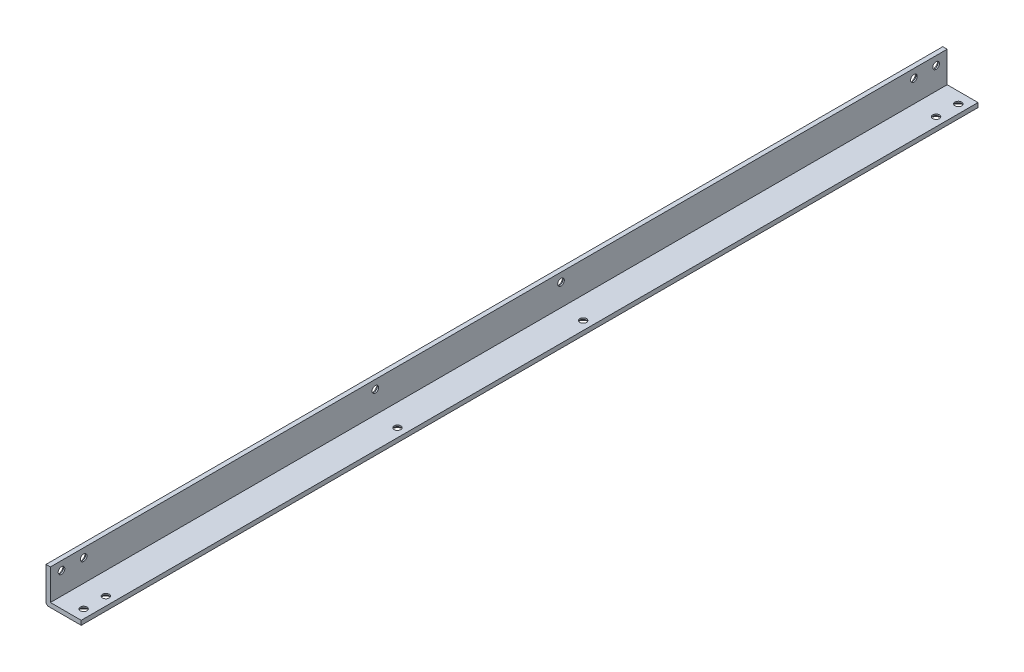
ISO-10303-21;
HEADER;
FILE_DESCRIPTION(('STEP AP214'),'2;1');
FILE_NAME('part.step','',(''),(''),'','','');
FILE_SCHEMA(('AUTOMOTIVE_DESIGN { 1 0 10303 214 1 1 1 1 }'));
ENDSEC;
DATA;
#1=APPLICATION_CONTEXT('core data for automotive mechanical design processes');
#2=APPLICATION_PROTOCOL_DEFINITION('international standard','automotive_design',2000,#1);
#3=PRODUCT_CONTEXT('',#1,'mechanical');
#4=PRODUCT('Part','Part','',(#3));
#5=PRODUCT_RELATED_PRODUCT_CATEGORY('part','',(#4));
#6=PRODUCT_DEFINITION_FORMATION('','',#4);
#7=PRODUCT_DEFINITION_CONTEXT('part definition',#1,'design');
#8=PRODUCT_DEFINITION('design','',#6,#7);
#9=PRODUCT_DEFINITION_SHAPE('','',#8);
#10=(LENGTH_UNIT() NAMED_UNIT(*) SI_UNIT(.MILLI.,.METRE.));
#11=(NAMED_UNIT(*) PLANE_ANGLE_UNIT() SI_UNIT($,.RADIAN.));
#12=(NAMED_UNIT(*) SI_UNIT($,.STERADIAN.) SOLID_ANGLE_UNIT());
#13=UNCERTAINTY_MEASURE_WITH_UNIT(LENGTH_MEASURE(1.E-05),#10,'distance_accuracy_value','');
#14=(GEOMETRIC_REPRESENTATION_CONTEXT(3) GLOBAL_UNCERTAINTY_ASSIGNED_CONTEXT((#13)) GLOBAL_UNIT_ASSIGNED_CONTEXT((#10,
#11,#12)) REPRESENTATION_CONTEXT('',''));
#15=CARTESIAN_POINT('',(0.,0.,0.));
#16=DIRECTION('',(0.,0.,1.));
#17=DIRECTION('',(1.,0.,0.));
#18=AXIS2_PLACEMENT_3D('',#15,#16,#17);
#19=CARTESIAN_POINT('',(0.,1.5875,0.));
#20=DIRECTION('',(1.,0.,0.));
#21=DIRECTION('',(0.,0.,-1.));
#22=AXIS2_PLACEMENT_3D('',#19,#20,#21);
#23=PLANE('',#22);
#24=CARTESIAN_POINT('',(0.,9.5875,4.));
#25=DIRECTION('',(-1.,0.,0.));
#26=DIRECTION('',(0.,0.,1.));
#27=AXIS2_PLACEMENT_3D('',#24,#25,#26);
#28=CIRCLE('',#27,2.3);
#29=CARTESIAN_POINT('',(0.,9.5875,6.3));
#30=VERTEX_POINT('',#29);
#31=EDGE_CURVE('E183',#30,#30,#28,.T.);
#32=ORIENTED_EDGE('',*,*,#31,.F.);
#33=EDGE_LOOP('',(#32));
#34=FACE_BOUND('',#33,.T.);
#35=CARTESIAN_POINT('',(0.,9.5875,12.));
#36=DIRECTION('',(-1.,0.,0.));
#37=DIRECTION('',(0.,0.,1.));
#38=AXIS2_PLACEMENT_3D('',#35,#36,#37);
#39=CIRCLE('',#38,2.3);
#40=CARTESIAN_POINT('',(0.,9.5875,14.3));
#41=VERTEX_POINT('',#40);
#42=EDGE_CURVE('E178',#41,#41,#39,.T.);
#43=ORIENTED_EDGE('',*,*,#42,.F.);
#44=EDGE_LOOP('',(#43));
#45=FACE_BOUND('',#44,.T.);
#46=CARTESIAN_POINT('',(0.,9.5875,139.3));
#47=DIRECTION('',(-1.,0.,0.));
#48=DIRECTION('',(0.,0.,1.));
#49=AXIS2_PLACEMENT_3D('',#46,#47,#48);
#50=CIRCLE('',#49,2.3);
#51=CARTESIAN_POINT('',(0.,9.5875,141.6));
#52=VERTEX_POINT('',#51);
#53=EDGE_CURVE('E173',#52,#52,#50,.T.);
#54=ORIENTED_EDGE('',*,*,#53,.F.);
#55=EDGE_LOOP('',(#54));
#56=FACE_BOUND('',#55,.T.);
#57=CARTESIAN_POINT('',(0.,9.5875,206.3));
#58=DIRECTION('',(-1.,0.,0.));
#59=DIRECTION('',(0.,0.,1.));
#60=AXIS2_PLACEMENT_3D('',#57,#58,#59);
#61=CIRCLE('',#60,2.3);
#62=CARTESIAN_POINT('',(0.,9.5875,208.6));
#63=VERTEX_POINT('',#62);
#64=EDGE_CURVE('E168',#63,#63,#61,.T.);
#65=ORIENTED_EDGE('',*,*,#64,.F.);
#66=EDGE_LOOP('',(#65));
#67=FACE_BOUND('',#66,.T.);
#68=CARTESIAN_POINT('',(0.,9.5875,311.5));
#69=DIRECTION('',(-1.,0.,0.));
#70=DIRECTION('',(0.,0.,1.));
#71=AXIS2_PLACEMENT_3D('',#68,#69,#70);
#72=CIRCLE('',#71,2.3);
#73=CARTESIAN_POINT('',(0.,9.5875,313.8));
#74=VERTEX_POINT('',#73);
#75=EDGE_CURVE('E158',#74,#74,#72,.T.);
#76=ORIENTED_EDGE('',*,*,#75,.F.);
#77=EDGE_LOOP('',(#76));
#78=FACE_BOUND('',#77,.T.);
#79=DIRECTION('',(0.,-1.,0.));
#80=VECTOR('',#79,1.);
#81=CARTESIAN_POINT('',(0.,1.5875,0.));
#82=LINE('',#81,#80);
#83=CARTESIAN_POINT('',(0.,12.7,0.));
#84=VERTEX_POINT('',#83);
#85=CARTESIAN_POINT('',(0.,1.,0.));
#86=VERTEX_POINT('',#85);
#87=EDGE_CURVE('E139',#84,#86,#82,.T.);
#88=ORIENTED_EDGE('',*,*,#87,.T.);
#89=DIRECTION('',(0.,0.,1.));
#90=VECTOR('',#89,1.);
#91=CARTESIAN_POINT('',(0.,1.,0.));
#92=LINE('',#91,#90);
#93=CARTESIAN_POINT('',(0.,1.,323.5));
#94=VERTEX_POINT('',#93);
#95=EDGE_CURVE('E99',#86,#94,#92,.T.);
#96=ORIENTED_EDGE('',*,*,#95,.T.);
#97=DIRECTION('',(0.,-1.,0.));
#98=VECTOR('',#97,1.);
#99=CARTESIAN_POINT('',(0.,1.5875,323.5));
#100=LINE('',#99,#98);
#101=CARTESIAN_POINT('',(0.,12.7,323.5));
#102=VERTEX_POINT('',#101);
#103=EDGE_CURVE('E92',#102,#94,#100,.T.);
#104=ORIENTED_EDGE('',*,*,#103,.F.);
#105=DIRECTION('',(0.,0.,1.));
#106=VECTOR('',#105,1.);
#107=CARTESIAN_POINT('',(0.,12.7,0.));
#108=LINE('',#107,#106);
#109=EDGE_CURVE('E97',#84,#102,#108,.T.);
#110=ORIENTED_EDGE('',*,*,#109,.F.);
#111=EDGE_LOOP('',(#88,#96,#104,#110));
#112=FACE_BOUND('',#111,.T.);
#113=CARTESIAN_POINT('',(0.,9.5875,319.5));
#114=DIRECTION('',(-1.,0.,0.));
#115=DIRECTION('',(0.,0.,1.));
#116=AXIS2_PLACEMENT_3D('',#113,#114,#115);
#117=CIRCLE('',#116,2.3);
#118=CARTESIAN_POINT('',(0.,9.5875,321.8));
#119=VERTEX_POINT('',#118);
#120=EDGE_CURVE('E163',#119,#119,#117,.T.);
#121=ORIENTED_EDGE('',*,*,#120,.F.);
#122=EDGE_LOOP('',(#121));
#123=FACE_BOUND('',#122,.T.);
#124=ADVANCED_FACE('F32',(#34,#45,#56,#67,#78,#112,#123),#23,.F.);
#125=CARTESIAN_POINT('',(0.,1.5875,323.5));
#126=DIRECTION('',(0.,0.,-1.));
#127=DIRECTION('',(-1.,0.,0.));
#128=AXIS2_PLACEMENT_3D('',#125,#126,#127);
#129=PLANE('',#128);
#130=ORIENTED_EDGE('',*,*,#103,.T.);
#131=CARTESIAN_POINT('',(1.,1.,323.5));
#132=DIRECTION('',(0.,0.,-1.));
#133=DIRECTION('',(-1.,0.,0.));
#134=AXIS2_PLACEMENT_3D('',#131,#132,#133);
#135=CIRCLE('',#134,1.);
#136=CARTESIAN_POINT('',(1.,0.,323.5));
#137=VERTEX_POINT('',#136);
#138=EDGE_CURVE('E56',#94,#137,#135,.F.);
#139=ORIENTED_EDGE('',*,*,#138,.T.);
#140=DIRECTION('',(1.,0.,0.));
#141=VECTOR('',#140,1.);
#142=CARTESIAN_POINT('',(0.,0.,323.5));
#143=LINE('',#142,#141);
#144=CARTESIAN_POINT('',(12.7,0.,323.5));
#145=VERTEX_POINT('',#144);
#146=EDGE_CURVE('E131',#137,#145,#143,.T.);
#147=ORIENTED_EDGE('',*,*,#146,.T.);
#148=DIRECTION('',(0.,-1.,0.));
#149=VECTOR('',#148,1.);
#150=CARTESIAN_POINT('',(12.7,1.5875,323.5));
#151=LINE('',#150,#149);
#152=CARTESIAN_POINT('',(12.7,1.5875,323.5));
#153=VERTEX_POINT('',#152);
#154=EDGE_CURVE('E100',#153,#145,#151,.T.);
#155=ORIENTED_EDGE('',*,*,#154,.F.);
#156=DIRECTION('',(1.,0.,0.));
#157=VECTOR('',#156,1.);
#158=CARTESIAN_POINT('',(0.,1.5875,323.5));
#159=LINE('',#158,#157);
#160=CARTESIAN_POINT('',(1.58750000000002,1.5875,323.5));
#161=VERTEX_POINT('',#160);
#162=EDGE_CURVE('E132',#161,#153,#159,.T.);
#163=ORIENTED_EDGE('',*,*,#162,.F.);
#164=DIRECTION('',(0.,-1.,0.));
#165=VECTOR('',#164,1.);
#166=CARTESIAN_POINT('',(1.58750000000004,12.7,323.5));
#167=LINE('',#166,#165);
#168=CARTESIAN_POINT('',(1.58750000000004,12.7,323.5));
#169=VERTEX_POINT('',#168);
#170=EDGE_CURVE('E107',#169,#161,#167,.T.);
#171=ORIENTED_EDGE('',*,*,#170,.F.);
#172=DIRECTION('',(1.,0.,0.));
#173=VECTOR('',#172,1.);
#174=CARTESIAN_POINT('',(0.,12.7,323.5));
#175=LINE('',#174,#173);
#176=EDGE_CURVE('E103',#102,#169,#175,.T.);
#177=ORIENTED_EDGE('',*,*,#176,.F.);
#178=EDGE_LOOP('',(#130,#139,#147,#155,#163,#171,#177));
#179=FACE_BOUND('',#178,.T.);
#180=ADVANCED_FACE('F104',(#179),#129,.F.);
#181=CARTESIAN_POINT('',(12.7,1.5875,0.));
#182=DIRECTION('',(-1.,0.,0.));
#183=DIRECTION('',(0.,0.,1.));
#184=AXIS2_PLACEMENT_3D('',#181,#182,#183);
#185=PLANE('',#184);
#186=DIRECTION('',(0.,0.,-1.));
#187=VECTOR('',#186,1.);
#188=CARTESIAN_POINT('',(12.7,0.,0.));
#189=LINE('',#188,#187);
#190=CARTESIAN_POINT('',(12.7,0.,0.));
#191=VERTEX_POINT('',#190);
#192=EDGE_CURVE('E141',#145,#191,#189,.T.);
#193=ORIENTED_EDGE('',*,*,#192,.T.);
#194=DIRECTION('',(0.,-1.,0.));
#195=VECTOR('',#194,1.);
#196=CARTESIAN_POINT('',(12.7,1.5875,0.));
#197=LINE('',#196,#195);
#198=CARTESIAN_POINT('',(12.7,1.5875,0.));
#199=VERTEX_POINT('',#198);
#200=EDGE_CURVE('E145',#199,#191,#197,.T.);
#201=ORIENTED_EDGE('',*,*,#200,.F.);
#202=DIRECTION('',(0.,0.,-1.));
#203=VECTOR('',#202,1.);
#204=CARTESIAN_POINT('',(12.7,1.5875,0.));
#205=LINE('',#204,#203);
#206=EDGE_CURVE('E134',#153,#199,#205,.T.);
#207=ORIENTED_EDGE('',*,*,#206,.F.);
#208=ORIENTED_EDGE('',*,*,#154,.T.);
#209=EDGE_LOOP('',(#193,#201,#207,#208));
#210=FACE_BOUND('',#209,.T.);
#211=ADVANCED_FACE('F277',(#210),#185,.F.);
#212=CARTESIAN_POINT('',(0.,1.5875,0.));
#213=DIRECTION('',(0.,0.,1.));
#214=DIRECTION('',(1.,0.,0.));
#215=AXIS2_PLACEMENT_3D('',#212,#213,#214);
#216=PLANE('',#215);
#217=DIRECTION('',(-1.,0.,0.));
#218=VECTOR('',#217,1.);
#219=CARTESIAN_POINT('',(0.,0.,0.));
#220=LINE('',#219,#218);
#221=CARTESIAN_POINT('',(1.,0.,0.));
#222=VERTEX_POINT('',#221);
#223=EDGE_CURVE('E135',#191,#222,#220,.T.);
#224=ORIENTED_EDGE('',*,*,#223,.T.);
#225=CARTESIAN_POINT('',(1.,1.,0.));
#226=DIRECTION('',(0.,0.,1.));
#227=DIRECTION('',(1.,0.,0.));
#228=AXIS2_PLACEMENT_3D('',#225,#226,#227);
#229=CIRCLE('',#228,1.);
#230=EDGE_CURVE('E11',#222,#86,#229,.F.);
#231=ORIENTED_EDGE('',*,*,#230,.T.);
#232=ORIENTED_EDGE('',*,*,#87,.F.);
#233=DIRECTION('',(-1.,0.,0.));
#234=VECTOR('',#233,1.);
#235=CARTESIAN_POINT('',(0.,12.7,0.));
#236=LINE('',#235,#234);
#237=CARTESIAN_POINT('',(1.5875,12.7,0.));
#238=VERTEX_POINT('',#237);
#239=EDGE_CURVE('E115',#238,#84,#236,.T.);
#240=ORIENTED_EDGE('',*,*,#239,.F.);
#241=DIRECTION('',(0.,-1.,0.));
#242=VECTOR('',#241,1.);
#243=CARTESIAN_POINT('',(1.5875,12.7,0.));
#244=LINE('',#243,#242);
#245=CARTESIAN_POINT('',(1.5875,1.5875,0.));
#246=VERTEX_POINT('',#245);
#247=EDGE_CURVE('E126',#238,#246,#244,.T.);
#248=ORIENTED_EDGE('',*,*,#247,.T.);
#249=DIRECTION('',(-1.,0.,0.));
#250=VECTOR('',#249,1.);
#251=CARTESIAN_POINT('',(0.,1.5875,0.));
#252=LINE('',#251,#250);
#253=EDGE_CURVE('E137',#199,#246,#252,.T.);
#254=ORIENTED_EDGE('',*,*,#253,.F.);
#255=ORIENTED_EDGE('',*,*,#200,.T.);
#256=EDGE_LOOP('',(#224,#231,#232,#240,#248,#254,#255));
#257=FACE_BOUND('',#256,.T.);
#258=ADVANCED_FACE('F284',(#257),#216,.F.);
#259=CARTESIAN_POINT('',(0.,1.5875,0.));
#260=DIRECTION('',(0.,1.,0.));
#261=DIRECTION('',(0.,0.,1.));
#262=AXIS2_PLACEMENT_3D('',#259,#260,#261);
#263=PLANE('',#262);
#264=CARTESIAN_POINT('',(9.58750000000004,1.5875,4.));
#265=DIRECTION('',(0.,1.,0.));
#266=DIRECTION('',(0.,0.,1.));
#267=AXIS2_PLACEMENT_3D('',#264,#265,#266);
#268=CIRCLE('',#267,1.19999999999999);
#269=CARTESIAN_POINT('',(9.58750000000004,1.5875,5.19999999999999));
#270=VERTEX_POINT('',#269);
#271=EDGE_CURVE('E36',#270,#270,#268,.T.);
#272=ORIENTED_EDGE('',*,*,#271,.F.);
#273=EDGE_LOOP('',(#272));
#274=FACE_BOUND('',#273,.T.);
#275=CARTESIAN_POINT('',(9.58750000000004,1.5875,12.));
#276=DIRECTION('',(0.,1.,0.));
#277=DIRECTION('',(0.,0.,1.));
#278=AXIS2_PLACEMENT_3D('',#275,#276,#277);
#279=CIRCLE('',#278,1.19999999999999);
#280=CARTESIAN_POINT('',(9.58750000000004,1.5875,13.2));
#281=VERTEX_POINT('',#280);
#282=EDGE_CURVE('E199',#281,#281,#279,.T.);
#283=ORIENTED_EDGE('',*,*,#282,.F.);
#284=EDGE_LOOP('',(#283));
#285=FACE_BOUND('',#284,.T.);
#286=CARTESIAN_POINT('',(9.58750000000004,1.5875,139.3));
#287=DIRECTION('',(0.,1.,0.));
#288=DIRECTION('',(0.,0.,1.));
#289=AXIS2_PLACEMENT_3D('',#286,#287,#288);
#290=CIRCLE('',#289,1.19999999999999);
#291=CARTESIAN_POINT('',(9.58750000000004,1.5875,140.5));
#292=VERTEX_POINT('',#291);
#293=EDGE_CURVE('E195',#292,#292,#290,.T.);
#294=ORIENTED_EDGE('',*,*,#293,.F.);
#295=EDGE_LOOP('',(#294));
#296=FACE_BOUND('',#295,.T.);
#297=CARTESIAN_POINT('',(9.58750000000004,1.5875,206.3));
#298=DIRECTION('',(0.,1.,0.));
#299=DIRECTION('',(0.,0.,1.));
#300=AXIS2_PLACEMENT_3D('',#297,#298,#299);
#301=CIRCLE('',#300,1.19999999999999);
#302=CARTESIAN_POINT('',(9.58750000000004,1.5875,207.5));
#303=VERTEX_POINT('',#302);
#304=EDGE_CURVE('E190',#303,#303,#301,.T.);
#305=ORIENTED_EDGE('',*,*,#304,.F.);
#306=EDGE_LOOP('',(#305));
#307=FACE_BOUND('',#306,.T.);
#308=CARTESIAN_POINT('',(9.58750000000004,1.5875,311.5));
#309=DIRECTION('',(0.,1.,0.));
#310=DIRECTION('',(0.,0.,1.));
#311=AXIS2_PLACEMENT_3D('',#308,#309,#310);
#312=CIRCLE('',#311,1.19999999999999);
#313=CARTESIAN_POINT('',(9.58750000000004,1.5875,312.7));
#314=VERTEX_POINT('',#313);
#315=EDGE_CURVE('E185',#314,#314,#312,.T.);
#316=ORIENTED_EDGE('',*,*,#315,.F.);
#317=EDGE_LOOP('',(#316));
#318=FACE_BOUND('',#317,.T.);
#319=CARTESIAN_POINT('',(9.58750000000004,1.5875,319.5));
#320=DIRECTION('',(0.,1.,0.));
#321=DIRECTION('',(0.,0.,1.));
#322=AXIS2_PLACEMENT_3D('',#319,#320,#321);
#323=CIRCLE('',#322,1.19999999999999);
#324=CARTESIAN_POINT('',(9.58750000000004,1.5875,320.7));
#325=VERTEX_POINT('',#324);
#326=EDGE_CURVE('E180',#325,#325,#323,.T.);
#327=ORIENTED_EDGE('',*,*,#326,.F.);
#328=EDGE_LOOP('',(#327));
#329=FACE_BOUND('',#328,.T.);
#330=DIRECTION('',(0.,0.,-1.));
#331=VECTOR('',#330,1.);
#332=CARTESIAN_POINT('',(1.5875,1.5875,0.));
#333=LINE('',#332,#331);
#334=EDGE_CURVE('E116',#161,#246,#333,.T.);
#335=ORIENTED_EDGE('',*,*,#334,.F.);
#336=ORIENTED_EDGE('',*,*,#162,.T.);
#337=ORIENTED_EDGE('',*,*,#206,.T.);
#338=ORIENTED_EDGE('',*,*,#253,.T.);
#339=EDGE_LOOP('',(#335,#336,#337,#338));
#340=FACE_BOUND('',#339,.T.);
#341=ADVANCED_FACE('F288',(#274,#285,#296,#307,#318,#329,#340),#263,.T.);
#342=CARTESIAN_POINT('',(0.,0.,0.));
#343=DIRECTION('',(0.,1.,0.));
#344=DIRECTION('',(0.,0.,1.));
#345=AXIS2_PLACEMENT_3D('',#342,#343,#344);
#346=PLANE('',#345);
#347=CARTESIAN_POINT('',(9.58750000000004,0.,4.));
#348=DIRECTION('',(0.,-1.,0.));
#349=DIRECTION('',(0.,0.,-1.));
#350=AXIS2_PLACEMENT_3D('',#347,#348,#349);
#351=CIRCLE('',#350,2.3);
#352=CARTESIAN_POINT('',(9.58750000000004,0.,1.7));
#353=VERTEX_POINT('',#352);
#354=EDGE_CURVE('E563',#353,#353,#351,.T.);
#355=ORIENTED_EDGE('',*,*,#354,.F.);
#356=EDGE_LOOP('',(#355));
#357=FACE_BOUND('',#356,.T.);
#358=CARTESIAN_POINT('',(9.58750000000004,0.,12.));
#359=DIRECTION('',(0.,-1.,0.));
#360=DIRECTION('',(0.,0.,-1.));
#361=AXIS2_PLACEMENT_3D('',#358,#359,#360);
#362=CIRCLE('',#361,2.3);
#363=CARTESIAN_POINT('',(9.58750000000004,0.,9.70000000000001));
#364=VERTEX_POINT('',#363);
#365=EDGE_CURVE('E208',#364,#364,#362,.T.);
#366=ORIENTED_EDGE('',*,*,#365,.F.);
#367=EDGE_LOOP('',(#366));
#368=FACE_BOUND('',#367,.T.);
#369=CARTESIAN_POINT('',(9.58750000000004,0.,139.3));
#370=DIRECTION('',(0.,-1.,0.));
#371=DIRECTION('',(0.,0.,-1.));
#372=AXIS2_PLACEMENT_3D('',#369,#370,#371);
#373=CIRCLE('',#372,2.3);
#374=CARTESIAN_POINT('',(9.58750000000004,0.,137.));
#375=VERTEX_POINT('',#374);
#376=EDGE_CURVE('E201',#375,#375,#373,.T.);
#377=ORIENTED_EDGE('',*,*,#376,.F.);
#378=EDGE_LOOP('',(#377));
#379=FACE_BOUND('',#378,.T.);
#380=CARTESIAN_POINT('',(9.58750000000004,0.,206.3));
#381=DIRECTION('',(0.,-1.,0.));
#382=DIRECTION('',(0.,0.,-1.));
#383=AXIS2_PLACEMENT_3D('',#380,#381,#382);
#384=CIRCLE('',#383,2.3);
#385=CARTESIAN_POINT('',(9.58750000000004,0.,204.));
#386=VERTEX_POINT('',#385);
#387=EDGE_CURVE('E197',#386,#386,#384,.T.);
#388=ORIENTED_EDGE('',*,*,#387,.F.);
#389=EDGE_LOOP('',(#388));
#390=FACE_BOUND('',#389,.T.);
#391=CARTESIAN_POINT('',(9.58750000000004,0.,311.5));
#392=DIRECTION('',(0.,-1.,0.));
#393=DIRECTION('',(0.,0.,-1.));
#394=AXIS2_PLACEMENT_3D('',#391,#392,#393);
#395=CIRCLE('',#394,2.3);
#396=CARTESIAN_POINT('',(9.58750000000004,0.,309.2));
#397=VERTEX_POINT('',#396);
#398=EDGE_CURVE('E193',#397,#397,#395,.T.);
#399=ORIENTED_EDGE('',*,*,#398,.F.);
#400=EDGE_LOOP('',(#399));
#401=FACE_BOUND('',#400,.T.);
#402=CARTESIAN_POINT('',(9.58750000000004,0.,319.5));
#403=DIRECTION('',(0.,-1.,0.));
#404=DIRECTION('',(0.,0.,-1.));
#405=AXIS2_PLACEMENT_3D('',#402,#403,#404);
#406=CIRCLE('',#405,2.3);
#407=CARTESIAN_POINT('',(9.58750000000004,0.,317.2));
#408=VERTEX_POINT('',#407);
#409=EDGE_CURVE('E188',#408,#408,#406,.T.);
#410=ORIENTED_EDGE('',*,*,#409,.F.);
#411=EDGE_LOOP('',(#410));
#412=FACE_BOUND('',#411,.T.);
#413=ORIENTED_EDGE('',*,*,#146,.F.);
#414=DIRECTION('',(0.,0.,1.));
#415=VECTOR('',#414,1.);
#416=CARTESIAN_POINT('',(1.,0.,0.));
#417=LINE('',#416,#415);
#418=EDGE_CURVE('E41',#137,#222,#417,.F.);
#419=ORIENTED_EDGE('',*,*,#418,.T.);
#420=ORIENTED_EDGE('',*,*,#223,.F.);
#421=ORIENTED_EDGE('',*,*,#192,.F.);
#422=EDGE_LOOP('',(#413,#419,#420,#421));
#423=FACE_BOUND('',#422,.T.);
#424=ADVANCED_FACE('F290',(#357,#368,#379,#390,#401,#412,#423),#346,.F.);
#425=CARTESIAN_POINT('',(1.5875,12.7,0.));
#426=DIRECTION('',(-1.,0.,0.));
#427=DIRECTION('',(0.,0.,1.));
#428=AXIS2_PLACEMENT_3D('',#425,#426,#427);
#429=PLANE('',#428);
#430=CARTESIAN_POINT('',(1.5875,9.5875,4.));
#431=DIRECTION('',(-1.,0.,0.));
#432=DIRECTION('',(0.,0.,1.));
#433=AXIS2_PLACEMENT_3D('',#430,#431,#432);
#434=CIRCLE('',#433,1.19999999999999);
#435=CARTESIAN_POINT('',(1.5875,9.5875,5.19999999999999));
#436=VERTEX_POINT('',#435);
#437=EDGE_CURVE('E175',#436,#436,#434,.T.);
#438=ORIENTED_EDGE('',*,*,#437,.T.);
#439=EDGE_LOOP('',(#438));
#440=FACE_BOUND('',#439,.T.);
#441=CARTESIAN_POINT('',(1.5875,9.5875,12.));
#442=DIRECTION('',(-1.,0.,0.));
#443=DIRECTION('',(0.,0.,1.));
#444=AXIS2_PLACEMENT_3D('',#441,#442,#443);
#445=CIRCLE('',#444,1.19999999999999);
#446=CARTESIAN_POINT('',(1.5875,9.5875,13.2));
#447=VERTEX_POINT('',#446);
#448=EDGE_CURVE('E170',#447,#447,#445,.T.);
#449=ORIENTED_EDGE('',*,*,#448,.T.);
#450=EDGE_LOOP('',(#449));
#451=FACE_BOUND('',#450,.T.);
#452=CARTESIAN_POINT('',(1.58750000000002,9.5875,139.3));
#453=DIRECTION('',(-1.,0.,0.));
#454=DIRECTION('',(0.,0.,1.));
#455=AXIS2_PLACEMENT_3D('',#452,#453,#454);
#456=CIRCLE('',#455,1.19999999999999);
#457=CARTESIAN_POINT('',(1.58750000000002,9.5875,140.5));
#458=VERTEX_POINT('',#457);
#459=EDGE_CURVE('E165',#458,#458,#456,.T.);
#460=ORIENTED_EDGE('',*,*,#459,.T.);
#461=EDGE_LOOP('',(#460));
#462=FACE_BOUND('',#461,.T.);
#463=CARTESIAN_POINT('',(1.58750000000003,9.5875,206.3));
#464=DIRECTION('',(-1.,0.,0.));
#465=DIRECTION('',(0.,0.,1.));
#466=AXIS2_PLACEMENT_3D('',#463,#464,#465);
#467=CIRCLE('',#466,1.19999999999999);
#468=CARTESIAN_POINT('',(1.58750000000003,9.5875,207.5));
#469=VERTEX_POINT('',#468);
#470=EDGE_CURVE('E160',#469,#469,#467,.T.);
#471=ORIENTED_EDGE('',*,*,#470,.T.);
#472=EDGE_LOOP('',(#471));
#473=FACE_BOUND('',#472,.T.);
#474=CARTESIAN_POINT('',(1.58750000000004,9.5875,319.5));
#475=DIRECTION('',(-1.,0.,0.));
#476=DIRECTION('',(0.,0.,1.));
#477=AXIS2_PLACEMENT_3D('',#474,#475,#476);
#478=CIRCLE('',#477,1.19999999999999);
#479=CARTESIAN_POINT('',(1.58750000000004,9.5875,320.7));
#480=VERTEX_POINT('',#479);
#481=EDGE_CURVE('E155',#480,#480,#478,.T.);
#482=ORIENTED_EDGE('',*,*,#481,.T.);
#483=EDGE_LOOP('',(#482));
#484=FACE_BOUND('',#483,.T.);
#485=CARTESIAN_POINT('',(1.58750000000004,9.5875,311.5));
#486=DIRECTION('',(-1.,0.,0.));
#487=DIRECTION('',(0.,0.,1.));
#488=AXIS2_PLACEMENT_3D('',#485,#486,#487);
#489=CIRCLE('',#488,1.19999999999999);
#490=CARTESIAN_POINT('',(1.58750000000004,9.5875,312.7));
#491=VERTEX_POINT('',#490);
#492=EDGE_CURVE('E119',#491,#491,#489,.T.);
#493=ORIENTED_EDGE('',*,*,#492,.T.);
#494=EDGE_LOOP('',(#493));
#495=FACE_BOUND('',#494,.T.);
#496=ORIENTED_EDGE('',*,*,#334,.T.);
#497=ORIENTED_EDGE('',*,*,#247,.F.);
#498=DIRECTION('',(0.,0.,-1.));
#499=VECTOR('',#498,1.);
#500=CARTESIAN_POINT('',(1.5875,12.7,0.));
#501=LINE('',#500,#499);
#502=EDGE_CURVE('E110',#169,#238,#501,.T.);
#503=ORIENTED_EDGE('',*,*,#502,.F.);
#504=ORIENTED_EDGE('',*,*,#170,.T.);
#505=EDGE_LOOP('',(#496,#497,#503,#504));
#506=FACE_BOUND('',#505,.T.);
#507=ADVANCED_FACE('F293',(#440,#451,#462,#473,#484,#495,#506),#429,.F.);
#508=CARTESIAN_POINT('',(0.,12.7,0.));
#509=DIRECTION('',(0.,1.,0.));
#510=DIRECTION('',(0.,0.,1.));
#511=AXIS2_PLACEMENT_3D('',#508,#509,#510);
#512=PLANE('',#511);
#513=ORIENTED_EDGE('',*,*,#109,.T.);
#514=ORIENTED_EDGE('',*,*,#176,.T.);
#515=ORIENTED_EDGE('',*,*,#502,.T.);
#516=ORIENTED_EDGE('',*,*,#239,.T.);
#517=EDGE_LOOP('',(#513,#514,#515,#516));
#518=FACE_BOUND('',#517,.T.);
#519=ADVANCED_FACE('F113',(#518),#512,.T.);
#520=CARTESIAN_POINT('',(1.,1.,0.));
#521=DIRECTION('',(0.,0.,1.));
#522=DIRECTION('',(1.,0.,0.));
#523=AXIS2_PLACEMENT_3D('',#520,#521,#522);
#524=CYLINDRICAL_SURFACE('',#523,1.);
#525=ORIENTED_EDGE('',*,*,#230,.F.);
#526=ORIENTED_EDGE('',*,*,#418,.F.);
#527=ORIENTED_EDGE('',*,*,#138,.F.);
#528=ORIENTED_EDGE('',*,*,#95,.F.);
#529=EDGE_LOOP('',(#525,#526,#527,#528));
#530=FACE_BOUND('',#529,.T.);
#531=ADVANCED_FACE('F34',(#530),#524,.T.);
#532=CARTESIAN_POINT('',(0.,9.5875,311.5));
#533=DIRECTION('',(-1.,0.,0.));
#534=DIRECTION('',(0.,0.,1.));
#535=AXIS2_PLACEMENT_3D('',#532,#533,#534);
#536=CYLINDRICAL_SURFACE('',#535,1.19999999999999);
#537=CARTESIAN_POINT('',(1.1,9.5875,311.5));
#538=DIRECTION('',(-1.,0.,0.));
#539=DIRECTION('',(0.,0.,1.));
#540=AXIS2_PLACEMENT_3D('',#537,#538,#539);
#541=CIRCLE('',#540,1.2);
#542=CARTESIAN_POINT('',(1.1,9.5875,312.7));
#543=VERTEX_POINT('',#542);
#544=EDGE_CURVE('E122',#543,#543,#541,.T.);
#545=ORIENTED_EDGE('',*,*,#544,.T.);
#546=EDGE_LOOP('',(#545));
#547=FACE_BOUND('',#546,.T.);
#548=ORIENTED_EDGE('',*,*,#492,.F.);
#549=EDGE_LOOP('',(#548));
#550=FACE_BOUND('',#549,.T.);
#551=ADVANCED_FACE('F255',(#547,#550),#536,.F.);
#552=CARTESIAN_POINT('',(0.,9.5875,311.5));
#553=DIRECTION('',(-1.,0.,0.));
#554=DIRECTION('',(0.,0.,1.));
#555=AXIS2_PLACEMENT_3D('',#552,#553,#554);
#556=CONICAL_SURFACE('',#555,2.3,0.785398163397448);
#557=ORIENTED_EDGE('',*,*,#544,.F.);
#558=EDGE_LOOP('',(#557));
#559=FACE_BOUND('',#558,.T.);
#560=ORIENTED_EDGE('',*,*,#75,.T.);
#561=EDGE_LOOP('',(#560));
#562=FACE_BOUND('',#561,.T.);
#563=ADVANCED_FACE('F258',(#559,#562),#556,.F.);
#564=CARTESIAN_POINT('',(0.,9.5875,319.5));
#565=DIRECTION('',(-1.,0.,0.));
#566=DIRECTION('',(0.,0.,1.));
#567=AXIS2_PLACEMENT_3D('',#564,#565,#566);
#568=CYLINDRICAL_SURFACE('',#567,1.19999999999999);
#569=CARTESIAN_POINT('',(1.1,9.5875,319.5));
#570=DIRECTION('',(-1.,0.,0.));
#571=DIRECTION('',(0.,0.,1.));
#572=AXIS2_PLACEMENT_3D('',#569,#570,#571);
#573=CIRCLE('',#572,1.2);
#574=CARTESIAN_POINT('',(1.1,9.5875,320.7));
#575=VERTEX_POINT('',#574);
#576=EDGE_CURVE('E159',#575,#575,#573,.T.);
#577=ORIENTED_EDGE('',*,*,#576,.T.);
#578=EDGE_LOOP('',(#577));
#579=FACE_BOUND('',#578,.T.);
#580=ORIENTED_EDGE('',*,*,#481,.F.);
#581=EDGE_LOOP('',(#580));
#582=FACE_BOUND('',#581,.T.);
#583=ADVANCED_FACE('F260',(#579,#582),#568,.F.);
#584=CARTESIAN_POINT('',(0.,9.5875,319.5));
#585=DIRECTION('',(-1.,0.,0.));
#586=DIRECTION('',(0.,0.,1.));
#587=AXIS2_PLACEMENT_3D('',#584,#585,#586);
#588=CONICAL_SURFACE('',#587,2.3,0.785398163397448);
#589=ORIENTED_EDGE('',*,*,#576,.F.);
#590=EDGE_LOOP('',(#589));
#591=FACE_BOUND('',#590,.T.);
#592=ORIENTED_EDGE('',*,*,#120,.T.);
#593=EDGE_LOOP('',(#592));
#594=FACE_BOUND('',#593,.T.);
#595=ADVANCED_FACE('F266',(#591,#594),#588,.F.);
#596=CARTESIAN_POINT('',(0.,9.5875,206.3));
#597=DIRECTION('',(-1.,0.,0.));
#598=DIRECTION('',(0.,0.,1.));
#599=AXIS2_PLACEMENT_3D('',#596,#597,#598);
#600=CYLINDRICAL_SURFACE('',#599,1.19999999999999);
#601=CARTESIAN_POINT('',(1.1,9.5875,206.3));
#602=DIRECTION('',(-1.,0.,0.));
#603=DIRECTION('',(0.,0.,1.));
#604=AXIS2_PLACEMENT_3D('',#601,#602,#603);
#605=CIRCLE('',#604,1.2);
#606=CARTESIAN_POINT('',(1.1,9.5875,207.5));
#607=VERTEX_POINT('',#606);
#608=EDGE_CURVE('E164',#607,#607,#605,.T.);
#609=ORIENTED_EDGE('',*,*,#608,.T.);
#610=EDGE_LOOP('',(#609));
#611=FACE_BOUND('',#610,.T.);
#612=ORIENTED_EDGE('',*,*,#470,.F.);
#613=EDGE_LOOP('',(#612));
#614=FACE_BOUND('',#613,.T.);
#615=ADVANCED_FACE('F346',(#611,#614),#600,.F.);
#616=CARTESIAN_POINT('',(0.,9.5875,206.3));
#617=DIRECTION('',(-1.,0.,0.));
#618=DIRECTION('',(0.,0.,1.));
#619=AXIS2_PLACEMENT_3D('',#616,#617,#618);
#620=CONICAL_SURFACE('',#619,2.3,0.785398163397448);
#621=ORIENTED_EDGE('',*,*,#608,.F.);
#622=EDGE_LOOP('',(#621));
#623=FACE_BOUND('',#622,.T.);
#624=ORIENTED_EDGE('',*,*,#64,.T.);
#625=EDGE_LOOP('',(#624));
#626=FACE_BOUND('',#625,.T.);
#627=ADVANCED_FACE('F356',(#623,#626),#620,.F.);
#628=CARTESIAN_POINT('',(0.,9.5875,139.3));
#629=DIRECTION('',(-1.,0.,0.));
#630=DIRECTION('',(0.,0.,1.));
#631=AXIS2_PLACEMENT_3D('',#628,#629,#630);
#632=CYLINDRICAL_SURFACE('',#631,1.19999999999999);
#633=CARTESIAN_POINT('',(1.1,9.5875,139.3));
#634=DIRECTION('',(-1.,0.,0.));
#635=DIRECTION('',(0.,0.,1.));
#636=AXIS2_PLACEMENT_3D('',#633,#634,#635);
#637=CIRCLE('',#636,1.2);
#638=CARTESIAN_POINT('',(1.1,9.5875,140.5));
#639=VERTEX_POINT('',#638);
#640=EDGE_CURVE('E169',#639,#639,#637,.T.);
#641=ORIENTED_EDGE('',*,*,#640,.T.);
#642=EDGE_LOOP('',(#641));
#643=FACE_BOUND('',#642,.T.);
#644=ORIENTED_EDGE('',*,*,#459,.F.);
#645=EDGE_LOOP('',(#644));
#646=FACE_BOUND('',#645,.T.);
#647=ADVANCED_FACE('F366',(#643,#646),#632,.F.);
#648=CARTESIAN_POINT('',(0.,9.5875,139.3));
#649=DIRECTION('',(-1.,0.,0.));
#650=DIRECTION('',(0.,0.,1.));
#651=AXIS2_PLACEMENT_3D('',#648,#649,#650);
#652=CONICAL_SURFACE('',#651,2.3,0.785398163397448);
#653=ORIENTED_EDGE('',*,*,#640,.F.);
#654=EDGE_LOOP('',(#653));
#655=FACE_BOUND('',#654,.T.);
#656=ORIENTED_EDGE('',*,*,#53,.T.);
#657=EDGE_LOOP('',(#656));
#658=FACE_BOUND('',#657,.T.);
#659=ADVANCED_FACE('F376',(#655,#658),#652,.F.);
#660=CARTESIAN_POINT('',(0.,9.5875,12.));
#661=DIRECTION('',(-1.,0.,0.));
#662=DIRECTION('',(0.,0.,1.));
#663=AXIS2_PLACEMENT_3D('',#660,#661,#662);
#664=CYLINDRICAL_SURFACE('',#663,1.19999999999999);
#665=CARTESIAN_POINT('',(1.1,9.5875,12.));
#666=DIRECTION('',(-1.,0.,0.));
#667=DIRECTION('',(0.,0.,1.));
#668=AXIS2_PLACEMENT_3D('',#665,#666,#667);
#669=CIRCLE('',#668,1.2);
#670=CARTESIAN_POINT('',(1.1,9.5875,13.2));
#671=VERTEX_POINT('',#670);
#672=EDGE_CURVE('E174',#671,#671,#669,.T.);
#673=ORIENTED_EDGE('',*,*,#672,.T.);
#674=EDGE_LOOP('',(#673));
#675=FACE_BOUND('',#674,.T.);
#676=ORIENTED_EDGE('',*,*,#448,.F.);
#677=EDGE_LOOP('',(#676));
#678=FACE_BOUND('',#677,.T.);
#679=ADVANCED_FACE('F386',(#675,#678),#664,.F.);
#680=CARTESIAN_POINT('',(0.,9.5875,12.));
#681=DIRECTION('',(-1.,0.,0.));
#682=DIRECTION('',(0.,0.,1.));
#683=AXIS2_PLACEMENT_3D('',#680,#681,#682);
#684=CONICAL_SURFACE('',#683,2.3,0.785398163397448);
#685=ORIENTED_EDGE('',*,*,#672,.F.);
#686=EDGE_LOOP('',(#685));
#687=FACE_BOUND('',#686,.T.);
#688=ORIENTED_EDGE('',*,*,#42,.T.);
#689=EDGE_LOOP('',(#688));
#690=FACE_BOUND('',#689,.T.);
#691=ADVANCED_FACE('F396',(#687,#690),#684,.F.);
#692=CARTESIAN_POINT('',(0.,9.5875,4.));
#693=DIRECTION('',(-1.,0.,0.));
#694=DIRECTION('',(0.,0.,1.));
#695=AXIS2_PLACEMENT_3D('',#692,#693,#694);
#696=CYLINDRICAL_SURFACE('',#695,1.19999999999999);
#697=CARTESIAN_POINT('',(1.1,9.5875,4.));
#698=DIRECTION('',(-1.,0.,0.));
#699=DIRECTION('',(0.,0.,1.));
#700=AXIS2_PLACEMENT_3D('',#697,#698,#699);
#701=CIRCLE('',#700,1.2);
#702=CARTESIAN_POINT('',(1.1,9.5875,5.2));
#703=VERTEX_POINT('',#702);
#704=EDGE_CURVE('E179',#703,#703,#701,.T.);
#705=ORIENTED_EDGE('',*,*,#704,.T.);
#706=EDGE_LOOP('',(#705));
#707=FACE_BOUND('',#706,.T.);
#708=ORIENTED_EDGE('',*,*,#437,.F.);
#709=EDGE_LOOP('',(#708));
#710=FACE_BOUND('',#709,.T.);
#711=ADVANCED_FACE('F406',(#707,#710),#696,.F.);
#712=CARTESIAN_POINT('',(0.,9.5875,4.));
#713=DIRECTION('',(-1.,0.,0.));
#714=DIRECTION('',(0.,0.,1.));
#715=AXIS2_PLACEMENT_3D('',#712,#713,#714);
#716=CONICAL_SURFACE('',#715,2.3,0.785398163397448);
#717=ORIENTED_EDGE('',*,*,#704,.F.);
#718=EDGE_LOOP('',(#717));
#719=FACE_BOUND('',#718,.T.);
#720=ORIENTED_EDGE('',*,*,#31,.T.);
#721=EDGE_LOOP('',(#720));
#722=FACE_BOUND('',#721,.T.);
#723=ADVANCED_FACE('F416',(#719,#722),#716,.F.);
#724=CARTESIAN_POINT('',(9.58750000000004,0.,319.5));
#725=DIRECTION('',(0.,-1.,0.));
#726=DIRECTION('',(0.,0.,-1.));
#727=AXIS2_PLACEMENT_3D('',#724,#725,#726);
#728=CYLINDRICAL_SURFACE('',#727,1.19999999999999);
#729=ORIENTED_EDGE('',*,*,#326,.T.);
#730=EDGE_LOOP('',(#729));
#731=FACE_BOUND('',#730,.T.);
#732=CARTESIAN_POINT('',(9.58750000000004,1.1,319.5));
#733=DIRECTION('',(0.,-1.,0.));
#734=DIRECTION('',(0.,0.,-1.));
#735=AXIS2_PLACEMENT_3D('',#732,#733,#734);
#736=CIRCLE('',#735,1.2);
#737=CARTESIAN_POINT('',(9.58750000000004,1.1,318.3));
#738=VERTEX_POINT('',#737);
#739=EDGE_CURVE('E184',#738,#738,#736,.T.);
#740=ORIENTED_EDGE('',*,*,#739,.T.);
#741=EDGE_LOOP('',(#740));
#742=FACE_BOUND('',#741,.T.);
#743=ADVANCED_FACE('F425',(#731,#742),#728,.F.);
#744=CARTESIAN_POINT('',(9.58750000000004,0.,319.5));
#745=DIRECTION('',(0.,-1.,0.));
#746=DIRECTION('',(0.,0.,-1.));
#747=AXIS2_PLACEMENT_3D('',#744,#745,#746);
#748=CONICAL_SURFACE('',#747,2.3,0.785398163397449);
#749=ORIENTED_EDGE('',*,*,#739,.F.);
#750=EDGE_LOOP('',(#749));
#751=FACE_BOUND('',#750,.T.);
#752=ORIENTED_EDGE('',*,*,#409,.T.);
#753=EDGE_LOOP('',(#752));
#754=FACE_BOUND('',#753,.T.);
#755=ADVANCED_FACE('F444',(#751,#754),#748,.F.);
#756=CARTESIAN_POINT('',(9.58750000000004,0.,311.5));
#757=DIRECTION('',(0.,-1.,0.));
#758=DIRECTION('',(0.,0.,-1.));
#759=AXIS2_PLACEMENT_3D('',#756,#757,#758);
#760=CYLINDRICAL_SURFACE('',#759,1.19999999999999);
#761=ORIENTED_EDGE('',*,*,#315,.T.);
#762=EDGE_LOOP('',(#761));
#763=FACE_BOUND('',#762,.T.);
#764=CARTESIAN_POINT('',(9.58750000000004,1.1,311.5));
#765=DIRECTION('',(0.,-1.,0.));
#766=DIRECTION('',(0.,0.,-1.));
#767=AXIS2_PLACEMENT_3D('',#764,#765,#766);
#768=CIRCLE('',#767,1.2);
#769=CARTESIAN_POINT('',(9.58750000000004,1.1,310.3));
#770=VERTEX_POINT('',#769);
#771=EDGE_CURVE('E189',#770,#770,#768,.T.);
#772=ORIENTED_EDGE('',*,*,#771,.T.);
#773=EDGE_LOOP('',(#772));
#774=FACE_BOUND('',#773,.T.);
#775=ADVANCED_FACE('F454',(#763,#774),#760,.F.);
#776=CARTESIAN_POINT('',(9.58750000000004,0.,311.5));
#777=DIRECTION('',(0.,-1.,0.));
#778=DIRECTION('',(0.,0.,-1.));
#779=AXIS2_PLACEMENT_3D('',#776,#777,#778);
#780=CONICAL_SURFACE('',#779,2.3,0.785398163397449);
#781=ORIENTED_EDGE('',*,*,#771,.F.);
#782=EDGE_LOOP('',(#781));
#783=FACE_BOUND('',#782,.T.);
#784=ORIENTED_EDGE('',*,*,#398,.T.);
#785=EDGE_LOOP('',(#784));
#786=FACE_BOUND('',#785,.T.);
#787=ADVANCED_FACE('F464',(#783,#786),#780,.F.);
#788=CARTESIAN_POINT('',(9.58750000000004,0.,206.3));
#789=DIRECTION('',(0.,-1.,0.));
#790=DIRECTION('',(0.,0.,-1.));
#791=AXIS2_PLACEMENT_3D('',#788,#789,#790);
#792=CYLINDRICAL_SURFACE('',#791,1.19999999999999);
#793=ORIENTED_EDGE('',*,*,#304,.T.);
#794=EDGE_LOOP('',(#793));
#795=FACE_BOUND('',#794,.T.);
#796=CARTESIAN_POINT('',(9.58750000000004,1.1,206.3));
#797=DIRECTION('',(0.,-1.,0.));
#798=DIRECTION('',(0.,0.,-1.));
#799=AXIS2_PLACEMENT_3D('',#796,#797,#798);
#800=CIRCLE('',#799,1.2);
#801=CARTESIAN_POINT('',(9.58750000000004,1.1,205.1));
#802=VERTEX_POINT('',#801);
#803=EDGE_CURVE('E194',#802,#802,#800,.T.);
#804=ORIENTED_EDGE('',*,*,#803,.T.);
#805=EDGE_LOOP('',(#804));
#806=FACE_BOUND('',#805,.T.);
#807=ADVANCED_FACE('F474',(#795,#806),#792,.F.);
#808=CARTESIAN_POINT('',(9.58750000000004,0.,206.3));
#809=DIRECTION('',(0.,-1.,0.));
#810=DIRECTION('',(0.,0.,-1.));
#811=AXIS2_PLACEMENT_3D('',#808,#809,#810);
#812=CONICAL_SURFACE('',#811,2.3,0.785398163397449);
#813=ORIENTED_EDGE('',*,*,#803,.F.);
#814=EDGE_LOOP('',(#813));
#815=FACE_BOUND('',#814,.T.);
#816=ORIENTED_EDGE('',*,*,#387,.T.);
#817=EDGE_LOOP('',(#816));
#818=FACE_BOUND('',#817,.T.);
#819=ADVANCED_FACE('F484',(#815,#818),#812,.F.);
#820=CARTESIAN_POINT('',(9.58750000000004,0.,139.3));
#821=DIRECTION('',(0.,-1.,0.));
#822=DIRECTION('',(0.,0.,-1.));
#823=AXIS2_PLACEMENT_3D('',#820,#821,#822);
#824=CYLINDRICAL_SURFACE('',#823,1.19999999999999);
#825=ORIENTED_EDGE('',*,*,#293,.T.);
#826=EDGE_LOOP('',(#825));
#827=FACE_BOUND('',#826,.T.);
#828=CARTESIAN_POINT('',(9.58750000000004,1.1,139.3));
#829=DIRECTION('',(0.,-1.,0.));
#830=DIRECTION('',(0.,0.,-1.));
#831=AXIS2_PLACEMENT_3D('',#828,#829,#830);
#832=CIRCLE('',#831,1.2);
#833=CARTESIAN_POINT('',(9.58750000000004,1.1,138.1));
#834=VERTEX_POINT('',#833);
#835=EDGE_CURVE('E198',#834,#834,#832,.T.);
#836=ORIENTED_EDGE('',*,*,#835,.T.);
#837=EDGE_LOOP('',(#836));
#838=FACE_BOUND('',#837,.T.);
#839=ADVANCED_FACE('F494',(#827,#838),#824,.F.);
#840=CARTESIAN_POINT('',(9.58750000000004,0.,139.3));
#841=DIRECTION('',(0.,-1.,0.));
#842=DIRECTION('',(0.,0.,-1.));
#843=AXIS2_PLACEMENT_3D('',#840,#841,#842);
#844=CONICAL_SURFACE('',#843,2.3,0.785398163397449);
#845=ORIENTED_EDGE('',*,*,#835,.F.);
#846=EDGE_LOOP('',(#845));
#847=FACE_BOUND('',#846,.T.);
#848=ORIENTED_EDGE('',*,*,#376,.T.);
#849=EDGE_LOOP('',(#848));
#850=FACE_BOUND('',#849,.T.);
#851=ADVANCED_FACE('F504',(#847,#850),#844,.F.);
#852=CARTESIAN_POINT('',(9.58750000000004,0.,12.));
#853=DIRECTION('',(0.,-1.,0.));
#854=DIRECTION('',(0.,0.,-1.));
#855=AXIS2_PLACEMENT_3D('',#852,#853,#854);
#856=CYLINDRICAL_SURFACE('',#855,1.19999999999999);
#857=ORIENTED_EDGE('',*,*,#282,.T.);
#858=EDGE_LOOP('',(#857));
#859=FACE_BOUND('',#858,.T.);
#860=CARTESIAN_POINT('',(9.58750000000004,1.1,12.));
#861=DIRECTION('',(0.,-1.,0.));
#862=DIRECTION('',(0.,0.,-1.));
#863=AXIS2_PLACEMENT_3D('',#860,#861,#862);
#864=CIRCLE('',#863,1.2);
#865=CARTESIAN_POINT('',(9.58750000000004,1.1,10.8));
#866=VERTEX_POINT('',#865);
#867=EDGE_CURVE('E202',#866,#866,#864,.T.);
#868=ORIENTED_EDGE('',*,*,#867,.T.);
#869=EDGE_LOOP('',(#868));
#870=FACE_BOUND('',#869,.T.);
#871=ADVANCED_FACE('F514',(#859,#870),#856,.F.);
#872=CARTESIAN_POINT('',(9.58750000000004,0.,12.));
#873=DIRECTION('',(0.,-1.,0.));
#874=DIRECTION('',(0.,0.,-1.));
#875=AXIS2_PLACEMENT_3D('',#872,#873,#874);
#876=CONICAL_SURFACE('',#875,2.3,0.785398163397449);
#877=ORIENTED_EDGE('',*,*,#867,.F.);
#878=EDGE_LOOP('',(#877));
#879=FACE_BOUND('',#878,.T.);
#880=ORIENTED_EDGE('',*,*,#365,.T.);
#881=EDGE_LOOP('',(#880));
#882=FACE_BOUND('',#881,.T.);
#883=ADVANCED_FACE('F524',(#879,#882),#876,.F.);
#884=CARTESIAN_POINT('',(9.58750000000004,0.,4.));
#885=DIRECTION('',(0.,-1.,0.));
#886=DIRECTION('',(0.,0.,-1.));
#887=AXIS2_PLACEMENT_3D('',#884,#885,#886);
#888=CYLINDRICAL_SURFACE('',#887,1.19999999999999);
#889=ORIENTED_EDGE('',*,*,#271,.T.);
#890=EDGE_LOOP('',(#889));
#891=FACE_BOUND('',#890,.T.);
#892=CARTESIAN_POINT('',(9.58750000000004,1.1,4.));
#893=DIRECTION('',(0.,-1.,0.));
#894=DIRECTION('',(0.,0.,-1.));
#895=AXIS2_PLACEMENT_3D('',#892,#893,#894);
#896=CIRCLE('',#895,1.2);
#897=CARTESIAN_POINT('',(9.58750000000004,1.1,2.8));
#898=VERTEX_POINT('',#897);
#899=EDGE_CURVE('E560',#898,#898,#896,.T.);
#900=ORIENTED_EDGE('',*,*,#899,.T.);
#901=EDGE_LOOP('',(#900));
#902=FACE_BOUND('',#901,.T.);
#903=ADVANCED_FACE('F533',(#891,#902),#888,.F.);
#904=CARTESIAN_POINT('',(9.58750000000004,0.,4.));
#905=DIRECTION('',(0.,-1.,0.));
#906=DIRECTION('',(0.,0.,-1.));
#907=AXIS2_PLACEMENT_3D('',#904,#905,#906);
#908=CONICAL_SURFACE('',#907,2.3,0.785398163397449);
#909=ORIENTED_EDGE('',*,*,#899,.F.);
#910=EDGE_LOOP('',(#909));
#911=FACE_BOUND('',#910,.T.);
#912=ORIENTED_EDGE('',*,*,#354,.T.);
#913=EDGE_LOOP('',(#912));
#914=FACE_BOUND('',#913,.T.);
#915=ADVANCED_FACE('F543',(#911,#914),#908,.F.);
#916=CLOSED_SHELL('',(#124,#180,#211,#258,#341,#424,#507,#519,#531,#551,#563,#583,#595,#615,
#627,#647,#659,#679,#691,#711,#723,#743,#755,#775,#787,#807,#819,#839,#851,#871,#883,#903,#915));
#917=MANIFOLD_SOLID_BREP('B2',#916);
#918=ADVANCED_BREP_SHAPE_REPRESENTATION('',(#18,#917),#14);
#919=SHAPE_DEFINITION_REPRESENTATION(#9,#918);
ENDSEC;
END-ISO-10303-21;
